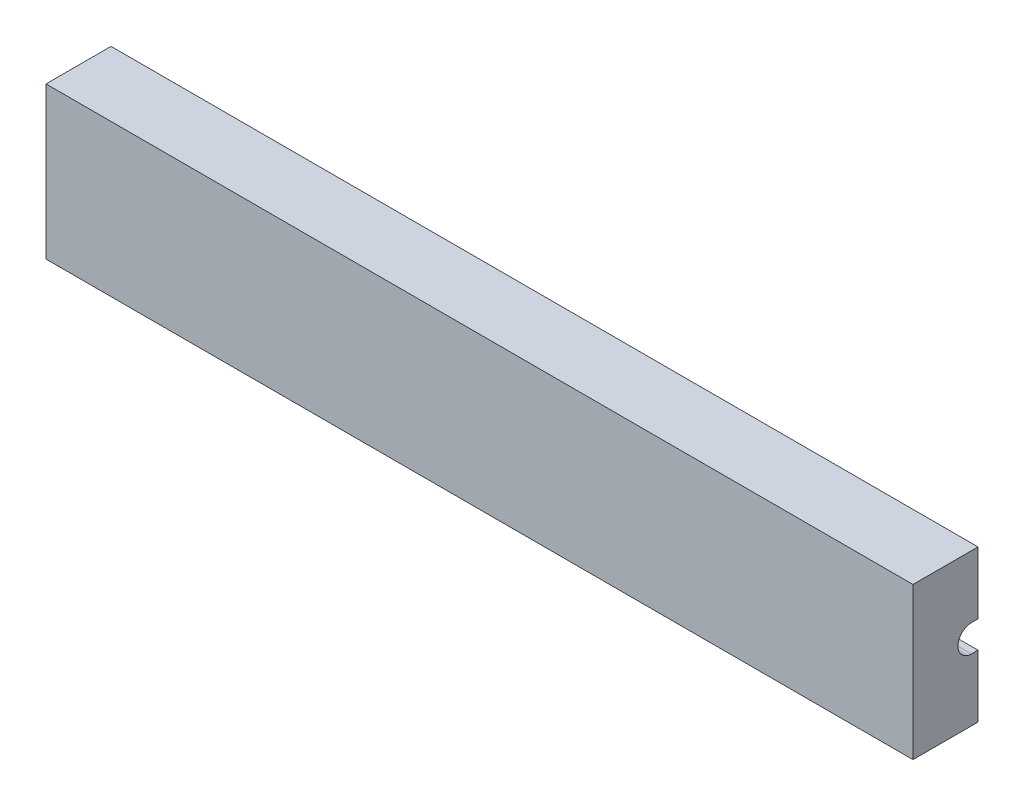
ISO-10303-21;
HEADER;
FILE_DESCRIPTION(('STEP AP214'),'2;1');
FILE_NAME('part.step','',(''),(''),'','','');
FILE_SCHEMA(('AUTOMOTIVE_DESIGN { 1 0 10303 214 1 1 1 1 }'));
ENDSEC;
DATA;
#1=APPLICATION_CONTEXT('core data for automotive mechanical design processes');
#2=APPLICATION_PROTOCOL_DEFINITION('international standard','automotive_design',2000,#1);
#3=PRODUCT_CONTEXT('',#1,'mechanical');
#4=PRODUCT('Part','Part','',(#3));
#5=PRODUCT_RELATED_PRODUCT_CATEGORY('part','',(#4));
#6=PRODUCT_DEFINITION_FORMATION('','',#4);
#7=PRODUCT_DEFINITION_CONTEXT('part definition',#1,'design');
#8=PRODUCT_DEFINITION('design','',#6,#7);
#9=PRODUCT_DEFINITION_SHAPE('','',#8);
#10=(LENGTH_UNIT() NAMED_UNIT(*) SI_UNIT(.MILLI.,.METRE.));
#11=(NAMED_UNIT(*) PLANE_ANGLE_UNIT() SI_UNIT($,.RADIAN.));
#12=(NAMED_UNIT(*) SI_UNIT($,.STERADIAN.) SOLID_ANGLE_UNIT());
#13=UNCERTAINTY_MEASURE_WITH_UNIT(LENGTH_MEASURE(1.E-05),#10,'distance_accuracy_value','');
#14=(GEOMETRIC_REPRESENTATION_CONTEXT(3) GLOBAL_UNCERTAINTY_ASSIGNED_CONTEXT((#13)) GLOBAL_UNIT_ASSIGNED_CONTEXT((#10,
#11,#12)) REPRESENTATION_CONTEXT('',''));
#15=CARTESIAN_POINT('',(0.,0.,0.));
#16=DIRECTION('',(0.,0.,1.));
#17=DIRECTION('',(1.,0.,0.));
#18=AXIS2_PLACEMENT_3D('',#15,#16,#17);
#19=CARTESIAN_POINT('',(170.645147999783,208.163538158501,240.970904960978));
#20=DIRECTION('',(0.,1.,0.));
#21=DIRECTION('',(0.,0.,1.));
#22=AXIS2_PLACEMENT_3D('',#19,#20,#21);
#23=PLANE('',#22);
#24=DIRECTION('',(1.,0.,0.));
#25=VECTOR('',#24,1.);
#26=CARTESIAN_POINT('',(170.645147999783,208.163538158501,246.970904960978));
#27=LINE('',#26,#25);
#28=CARTESIAN_POINT('',(170.645147999783,208.163538158501,246.970904960978));
#29=VERTEX_POINT('',#28);
#30=CARTESIAN_POINT('',(250.645147999783,208.163538158501,246.970904960978));
#31=VERTEX_POINT('',#30);
#32=EDGE_CURVE('E36',#29,#31,#27,.T.);
#33=ORIENTED_EDGE('',*,*,#32,.T.);
#34=DIRECTION('',(0.,0.,1.));
#35=VECTOR('',#34,1.);
#36=CARTESIAN_POINT('',(250.645147999783,208.163538158501,240.970904960978));
#37=LINE('',#36,#35);
#38=CARTESIAN_POINT('',(250.645147999783,208.163538158501,240.970904960978));
#39=VERTEX_POINT('',#38);
#40=EDGE_CURVE('E97',#39,#31,#37,.T.);
#41=ORIENTED_EDGE('',*,*,#40,.F.);
#42=DIRECTION('',(1.,0.,0.));
#43=VECTOR('',#42,1.);
#44=CARTESIAN_POINT('',(170.645147999783,208.163538158501,240.970904960978));
#45=LINE('',#44,#43);
#46=CARTESIAN_POINT('',(170.645147999783,208.163538158501,240.970904960978));
#47=VERTEX_POINT('',#46);
#48=EDGE_CURVE('E11',#47,#39,#45,.T.);
#49=ORIENTED_EDGE('',*,*,#48,.F.);
#50=DIRECTION('',(0.,0.,1.));
#51=VECTOR('',#50,1.);
#52=CARTESIAN_POINT('',(170.645147999783,208.163538158501,240.970904960978));
#53=LINE('',#52,#51);
#54=EDGE_CURVE('E99',#47,#29,#53,.T.);
#55=ORIENTED_EDGE('',*,*,#54,.T.);
#56=EDGE_LOOP('',(#33,#41,#49,#55));
#57=FACE_BOUND('',#56,.T.);
#58=ADVANCED_FACE('F33',(#57),#23,.T.);
#59=CARTESIAN_POINT('',(170.645147999783,205.163538158501,240.970904960978));
#60=DIRECTION('',(0.,0.,-1.));
#61=DIRECTION('',(-1.,0.,0.));
#62=AXIS2_PLACEMENT_3D('',#59,#60,#61);
#63=PLANE('',#62);
#64=ORIENTED_EDGE('',*,*,#48,.T.);
#65=DIRECTION('',(0.,1.,0.));
#66=VECTOR('',#65,1.);
#67=CARTESIAN_POINT('',(250.645147999783,202.413538158492,240.970904960978));
#68=LINE('',#67,#66);
#69=CARTESIAN_POINT('',(250.645147999783,202.413538158492,240.970904960978));
#70=VERTEX_POINT('',#69);
#71=EDGE_CURVE('E115',#70,#39,#68,.T.);
#72=ORIENTED_EDGE('',*,*,#71,.F.);
#73=DIRECTION('',(1.,0.,0.));
#74=VECTOR('',#73,1.);
#75=CARTESIAN_POINT('',(170.645147999783,202.413538158492,240.970904960978));
#76=LINE('',#75,#74);
#77=CARTESIAN_POINT('',(170.645147999783,202.413538158492,240.970904960978));
#78=VERTEX_POINT('',#77);
#79=EDGE_CURVE('E41',#78,#70,#76,.T.);
#80=ORIENTED_EDGE('',*,*,#79,.F.);
#81=DIRECTION('',(0.,1.,0.));
#82=VECTOR('',#81,1.);
#83=CARTESIAN_POINT('',(170.645147999783,202.413538158492,240.970904960978));
#84=LINE('',#83,#82);
#85=EDGE_CURVE('E48',#78,#47,#84,.T.);
#86=ORIENTED_EDGE('',*,*,#85,.T.);
#87=EDGE_LOOP('',(#64,#72,#80,#86));
#88=FACE_BOUND('',#87,.T.);
#89=ADVANCED_FACE('F180',(#88),#63,.T.);
#90=CARTESIAN_POINT('',(170.645147999783,202.413538158492,241.570904954906));
#91=DIRECTION('',(0.,-1.,0.));
#92=DIRECTION('',(0.,0.,-1.));
#93=AXIS2_PLACEMENT_3D('',#90,#91,#92);
#94=PLANE('',#93);
#95=ORIENTED_EDGE('',*,*,#79,.T.);
#96=DIRECTION('',(0.,0.,-1.));
#97=VECTOR('',#96,1.);
#98=CARTESIAN_POINT('',(250.645147999783,202.413538158492,241.570904954906));
#99=LINE('',#98,#97);
#100=CARTESIAN_POINT('',(250.645147999783,202.413538158492,241.570904954906));
#101=VERTEX_POINT('',#100);
#102=EDGE_CURVE('E128',#101,#70,#99,.T.);
#103=ORIENTED_EDGE('',*,*,#102,.F.);
#104=DIRECTION('',(1.,0.,0.));
#105=VECTOR('',#104,1.);
#106=CARTESIAN_POINT('',(170.645147999783,202.413538158492,241.570904954906));
#107=LINE('',#106,#105);
#108=CARTESIAN_POINT('',(170.645147999783,202.413538158492,241.570904954906));
#109=VERTEX_POINT('',#108);
#110=EDGE_CURVE('E150',#109,#101,#107,.T.);
#111=ORIENTED_EDGE('',*,*,#110,.F.);
#112=DIRECTION('',(0.,0.,-1.));
#113=VECTOR('',#112,1.);
#114=CARTESIAN_POINT('',(170.645147999783,202.413538158492,241.570904954906));
#115=LINE('',#114,#113);
#116=EDGE_CURVE('E145',#109,#78,#115,.T.);
#117=ORIENTED_EDGE('',*,*,#116,.T.);
#118=EDGE_LOOP('',(#95,#103,#111,#117));
#119=FACE_BOUND('',#118,.T.);
#120=ADVANCED_FACE('F178',(#119),#94,.T.);
#121=CARTESIAN_POINT('',(170.645147999783,201.163538158492,241.570904960977));
#122=DIRECTION('',(1.,0.,0.));
#123=DIRECTION('',(0.,0.,-1.));
#124=AXIS2_PLACEMENT_3D('',#121,#122,#123);
#125=CYLINDRICAL_SURFACE('',#124,1.25);
#126=ORIENTED_EDGE('',*,*,#110,.T.);
#127=CARTESIAN_POINT('',(250.645147999783,201.163538158492,241.570904960977));
#128=DIRECTION('',(-1.,0.,0.));
#129=DIRECTION('',(0.,0.,-1.));
#130=AXIS2_PLACEMENT_3D('',#127,#128,#129);
#131=CIRCLE('',#130,1.25);
#132=CARTESIAN_POINT('',(250.645147999783,199.913538158492,241.570904960977));
#133=VERTEX_POINT('',#132);
#134=EDGE_CURVE('E125',#133,#101,#131,.T.);
#135=ORIENTED_EDGE('',*,*,#134,.F.);
#136=DIRECTION('',(1.,0.,0.));
#137=VECTOR('',#136,1.);
#138=CARTESIAN_POINT('',(170.645147999783,199.913538158492,241.570904960977));
#139=LINE('',#138,#137);
#140=CARTESIAN_POINT('',(170.645147999783,199.913538158492,241.570904960977));
#141=VERTEX_POINT('',#140);
#142=EDGE_CURVE('E152',#141,#133,#139,.T.);
#143=ORIENTED_EDGE('',*,*,#142,.F.);
#144=CARTESIAN_POINT('',(170.645147999783,201.163538158492,241.570904960977));
#145=DIRECTION('',(-1.,0.,0.));
#146=DIRECTION('',(0.,0.,-1.));
#147=AXIS2_PLACEMENT_3D('',#144,#145,#146);
#148=CIRCLE('',#147,1.25);
#149=EDGE_CURVE('E142',#141,#109,#148,.T.);
#150=ORIENTED_EDGE('',*,*,#149,.T.);
#151=EDGE_LOOP('',(#126,#135,#143,#150));
#152=FACE_BOUND('',#151,.T.);
#153=ADVANCED_FACE('F174',(#152),#125,.F.);
#154=CARTESIAN_POINT('',(170.645147999783,199.913538158492,240.970904960978));
#155=DIRECTION('',(0.,1.,0.));
#156=DIRECTION('',(0.,0.,1.));
#157=AXIS2_PLACEMENT_3D('',#154,#155,#156);
#158=PLANE('',#157);
#159=ORIENTED_EDGE('',*,*,#142,.T.);
#160=DIRECTION('',(0.,0.,1.));
#161=VECTOR('',#160,1.);
#162=CARTESIAN_POINT('',(250.645147999783,199.913538158492,240.970904960978));
#163=LINE('',#162,#161);
#164=CARTESIAN_POINT('',(250.645147999783,199.913538158492,240.970904960978));
#165=VERTEX_POINT('',#164);
#166=EDGE_CURVE('E122',#165,#133,#163,.T.);
#167=ORIENTED_EDGE('',*,*,#166,.F.);
#168=DIRECTION('',(1.,0.,0.));
#169=VECTOR('',#168,1.);
#170=CARTESIAN_POINT('',(170.645147999783,199.913538158492,240.970904960978));
#171=LINE('',#170,#169);
#172=CARTESIAN_POINT('',(170.645147999783,199.913538158492,240.970904960978));
#173=VERTEX_POINT('',#172);
#174=EDGE_CURVE('E154',#173,#165,#171,.T.);
#175=ORIENTED_EDGE('',*,*,#174,.F.);
#176=DIRECTION('',(0.,0.,1.));
#177=VECTOR('',#176,1.);
#178=CARTESIAN_POINT('',(170.645147999783,199.913538158492,240.970904960978));
#179=LINE('',#178,#177);
#180=EDGE_CURVE('E139',#173,#141,#179,.T.);
#181=ORIENTED_EDGE('',*,*,#180,.T.);
#182=EDGE_LOOP('',(#159,#167,#175,#181));
#183=FACE_BOUND('',#182,.T.);
#184=ADVANCED_FACE('F168',(#183),#158,.T.);
#185=CARTESIAN_POINT('',(170.645147999783,197.163538158501,240.970904960978));
#186=DIRECTION('',(0.,0.,-1.));
#187=DIRECTION('',(-1.,0.,0.));
#188=AXIS2_PLACEMENT_3D('',#185,#186,#187);
#189=PLANE('',#188);
#190=ORIENTED_EDGE('',*,*,#174,.T.);
#191=DIRECTION('',(0.,1.,0.));
#192=VECTOR('',#191,1.);
#193=CARTESIAN_POINT('',(250.645147999783,194.163538158501,240.970904960978));
#194=LINE('',#193,#192);
#195=CARTESIAN_POINT('',(250.645147999783,194.163538158501,240.970904960978));
#196=VERTEX_POINT('',#195);
#197=EDGE_CURVE('E119',#196,#165,#194,.T.);
#198=ORIENTED_EDGE('',*,*,#197,.F.);
#199=DIRECTION('',(1.,0.,0.));
#200=VECTOR('',#199,1.);
#201=CARTESIAN_POINT('',(170.645147999783,194.163538158501,240.970904960978));
#202=LINE('',#201,#200);
#203=CARTESIAN_POINT('',(170.645147999783,194.163538158501,240.970904960978));
#204=VERTEX_POINT('',#203);
#205=EDGE_CURVE('E156',#204,#196,#202,.T.);
#206=ORIENTED_EDGE('',*,*,#205,.F.);
#207=DIRECTION('',(0.,1.,0.));
#208=VECTOR('',#207,1.);
#209=CARTESIAN_POINT('',(170.645147999783,194.163538158501,240.970904960978));
#210=LINE('',#209,#208);
#211=EDGE_CURVE('E137',#204,#173,#210,.T.);
#212=ORIENTED_EDGE('',*,*,#211,.T.);
#213=EDGE_LOOP('',(#190,#198,#206,#212));
#214=FACE_BOUND('',#213,.T.);
#215=ADVANCED_FACE('F164',(#214),#189,.T.);
#216=CARTESIAN_POINT('',(170.645147999783,194.163538158501,246.970904960978));
#217=DIRECTION('',(0.,-1.,0.));
#218=DIRECTION('',(0.,0.,-1.));
#219=AXIS2_PLACEMENT_3D('',#216,#217,#218);
#220=PLANE('',#219);
#221=ORIENTED_EDGE('',*,*,#205,.T.);
#222=DIRECTION('',(0.,0.,-1.));
#223=VECTOR('',#222,1.);
#224=CARTESIAN_POINT('',(250.645147999783,194.163538158501,246.970904960978));
#225=LINE('',#224,#223);
#226=CARTESIAN_POINT('',(250.645147999783,194.163538158501,246.970904960978));
#227=VERTEX_POINT('',#226);
#228=EDGE_CURVE('E110',#227,#196,#225,.T.);
#229=ORIENTED_EDGE('',*,*,#228,.F.);
#230=DIRECTION('',(1.,0.,0.));
#231=VECTOR('',#230,1.);
#232=CARTESIAN_POINT('',(170.645147999783,194.163538158501,246.970904960978));
#233=LINE('',#232,#231);
#234=CARTESIAN_POINT('',(170.645147999783,194.163538158501,246.970904960978));
#235=VERTEX_POINT('',#234);
#236=EDGE_CURVE('E102',#235,#227,#233,.T.);
#237=ORIENTED_EDGE('',*,*,#236,.F.);
#238=DIRECTION('',(0.,0.,-1.));
#239=VECTOR('',#238,1.);
#240=CARTESIAN_POINT('',(170.645147999783,194.163538158501,246.970904960978));
#241=LINE('',#240,#239);
#242=EDGE_CURVE('E134',#235,#204,#241,.T.);
#243=ORIENTED_EDGE('',*,*,#242,.T.);
#244=EDGE_LOOP('',(#221,#229,#237,#243));
#245=FACE_BOUND('',#244,.T.);
#246=ADVANCED_FACE('F158',(#245),#220,.T.);
#247=CARTESIAN_POINT('',(170.645147999783,197.163538158501,246.970904960978));
#248=DIRECTION('',(0.,0.,1.));
#249=DIRECTION('',(1.,0.,0.));
#250=AXIS2_PLACEMENT_3D('',#247,#248,#249);
#251=PLANE('',#250);
#252=ORIENTED_EDGE('',*,*,#236,.T.);
#253=DIRECTION('',(0.,-1.,0.));
#254=VECTOR('',#253,1.);
#255=CARTESIAN_POINT('',(250.645147999783,208.163538158501,246.970904960978));
#256=LINE('',#255,#254);
#257=EDGE_CURVE('E104',#31,#227,#256,.T.);
#258=ORIENTED_EDGE('',*,*,#257,.F.);
#259=ORIENTED_EDGE('',*,*,#32,.F.);
#260=DIRECTION('',(0.,-1.,0.));
#261=VECTOR('',#260,1.);
#262=CARTESIAN_POINT('',(170.645147999783,208.163538158501,246.970904960978));
#263=LINE('',#262,#261);
#264=EDGE_CURVE('E132',#29,#235,#263,.T.);
#265=ORIENTED_EDGE('',*,*,#264,.T.);
#266=EDGE_LOOP('',(#252,#258,#259,#265));
#267=FACE_BOUND('',#266,.T.);
#268=ADVANCED_FACE('F105',(#267),#251,.T.);
#269=CARTESIAN_POINT('',(170.645147999783,201.163538158492,241.570904960977));
#270=DIRECTION('',(1.,0.,0.));
#271=DIRECTION('',(0.,0.,-1.));
#272=AXIS2_PLACEMENT_3D('',#269,#270,#271);
#273=PLANE('',#272);
#274=ORIENTED_EDGE('',*,*,#54,.F.);
#275=ORIENTED_EDGE('',*,*,#85,.F.);
#276=ORIENTED_EDGE('',*,*,#116,.F.);
#277=ORIENTED_EDGE('',*,*,#149,.F.);
#278=ORIENTED_EDGE('',*,*,#180,.F.);
#279=ORIENTED_EDGE('',*,*,#211,.F.);
#280=ORIENTED_EDGE('',*,*,#242,.F.);
#281=ORIENTED_EDGE('',*,*,#264,.F.);
#282=EDGE_LOOP('',(#274,#275,#276,#277,#278,#279,#280,#281));
#283=FACE_BOUND('',#282,.T.);
#284=ADVANCED_FACE('F171',(#283),#273,.F.);
#285=CARTESIAN_POINT('',(250.645147999783,201.163538158492,241.570904960977));
#286=DIRECTION('',(1.,0.,0.));
#287=DIRECTION('',(0.,0.,-1.));
#288=AXIS2_PLACEMENT_3D('',#285,#286,#287);
#289=PLANE('',#288);
#290=ORIENTED_EDGE('',*,*,#40,.T.);
#291=ORIENTED_EDGE('',*,*,#257,.T.);
#292=ORIENTED_EDGE('',*,*,#228,.T.);
#293=ORIENTED_EDGE('',*,*,#197,.T.);
#294=ORIENTED_EDGE('',*,*,#166,.T.);
#295=ORIENTED_EDGE('',*,*,#134,.T.);
#296=ORIENTED_EDGE('',*,*,#102,.T.);
#297=ORIENTED_EDGE('',*,*,#71,.T.);
#298=EDGE_LOOP('',(#290,#291,#292,#293,#294,#295,#296,#297));
#299=FACE_BOUND('',#298,.T.);
#300=ADVANCED_FACE('F113',(#299),#289,.T.);
#301=CLOSED_SHELL('',(#58,#89,#120,#153,#184,#215,#246,#268,#284,#300));
#302=MANIFOLD_SOLID_BREP('B2',#301);
#303=ADVANCED_BREP_SHAPE_REPRESENTATION('',(#18,#302),#14);
#304=SHAPE_DEFINITION_REPRESENTATION(#9,#303);
ENDSEC;
END-ISO-10303-21;
